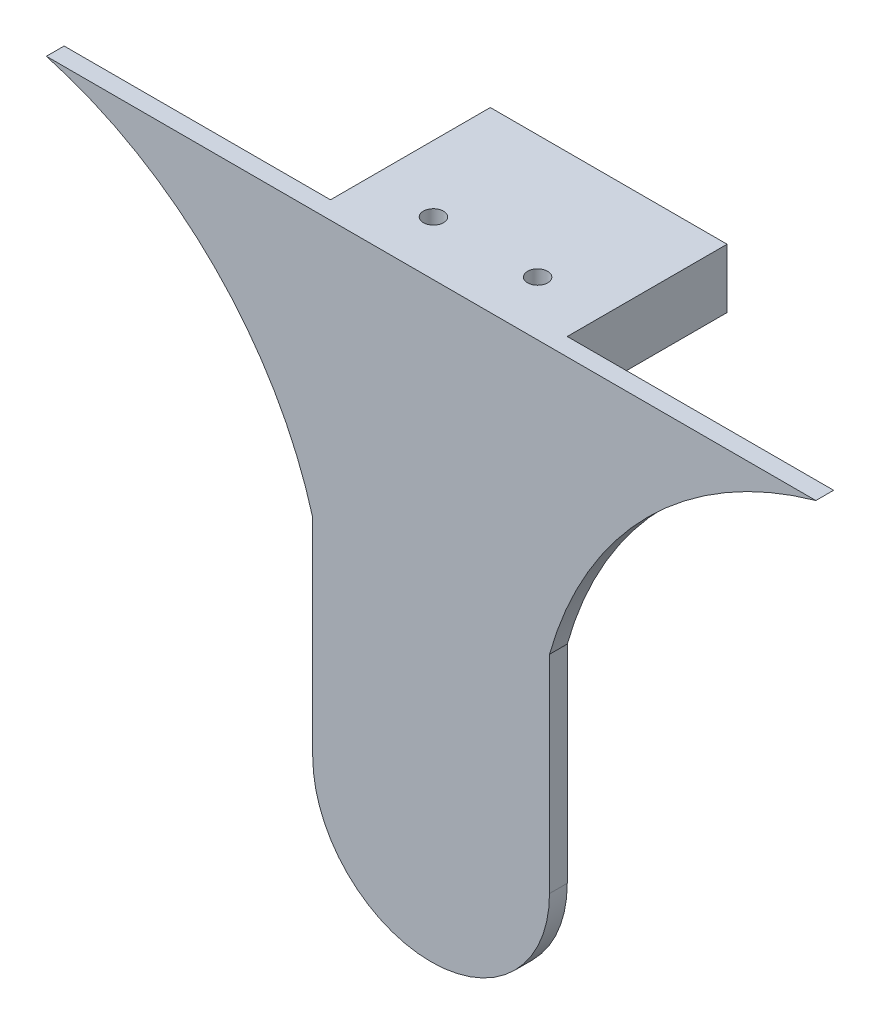
ISO-10303-21;
HEADER;
FILE_DESCRIPTION(('STEP AP214'),'2;1');
FILE_NAME('part.step','',(''),(''),'','','');
FILE_SCHEMA(('AUTOMOTIVE_DESIGN { 1 0 10303 214 1 1 1 1 }'));
ENDSEC;
DATA;
#1=APPLICATION_CONTEXT('core data for automotive mechanical design processes');
#2=APPLICATION_PROTOCOL_DEFINITION('international standard','automotive_design',2000,#1);
#3=PRODUCT_CONTEXT('',#1,'mechanical');
#4=PRODUCT('Part','Part','',(#3));
#5=PRODUCT_RELATED_PRODUCT_CATEGORY('part','',(#4));
#6=PRODUCT_DEFINITION_FORMATION('','',#4);
#7=PRODUCT_DEFINITION_CONTEXT('part definition',#1,'design');
#8=PRODUCT_DEFINITION('design','',#6,#7);
#9=PRODUCT_DEFINITION_SHAPE('','',#8);
#10=(LENGTH_UNIT() NAMED_UNIT(*) SI_UNIT(.MILLI.,.METRE.));
#11=(NAMED_UNIT(*) PLANE_ANGLE_UNIT() SI_UNIT($,.RADIAN.));
#12=(NAMED_UNIT(*) SI_UNIT($,.STERADIAN.) SOLID_ANGLE_UNIT());
#13=UNCERTAINTY_MEASURE_WITH_UNIT(LENGTH_MEASURE(1.E-05),#10,'distance_accuracy_value','');
#14=(GEOMETRIC_REPRESENTATION_CONTEXT(3) GLOBAL_UNCERTAINTY_ASSIGNED_CONTEXT((#13)) GLOBAL_UNIT_ASSIGNED_CONTEXT((#10,
#11,#12)) REPRESENTATION_CONTEXT('',''));
#15=CARTESIAN_POINT('',(0.,0.,0.));
#16=DIRECTION('',(0.,0.,1.));
#17=DIRECTION('',(1.,0.,0.));
#18=AXIS2_PLACEMENT_3D('',#15,#16,#17);
#19=CARTESIAN_POINT('',(0.,74.4444444444444,3.));
#20=DIRECTION('',(1.,0.,0.));
#21=DIRECTION('',(0.,1.,0.));
#22=AXIS2_PLACEMENT_3D('',#19,#20,#21);
#23=PLANE('',#22);
#24=DIRECTION('',(0.,-1.,0.));
#25=VECTOR('',#24,1.);
#26=CARTESIAN_POINT('',(0.,0.,0.));
#27=LINE('',#26,#25);
#28=CARTESIAN_POINT('',(0.,74.4444444444444,0.));
#29=VERTEX_POINT('',#28);
#30=CARTESIAN_POINT('',(0.,64.4444444444444,0.));
#31=VERTEX_POINT('',#30);
#32=EDGE_CURVE('E128',#29,#31,#27,.T.);
#33=ORIENTED_EDGE('',*,*,#32,.F.);
#34=DIRECTION('',(0.,0.,-1.));
#35=VECTOR('',#34,1.);
#36=CARTESIAN_POINT('',(0.,74.4444444444444,3.));
#37=LINE('',#36,#35);
#38=CARTESIAN_POINT('',(0.,74.4444444444444,-27.));
#39=VERTEX_POINT('',#38);
#40=EDGE_CURVE('E142',#29,#39,#37,.T.);
#41=ORIENTED_EDGE('',*,*,#40,.T.);
#42=DIRECTION('',(0.,1.,0.));
#43=VECTOR('',#42,1.);
#44=CARTESIAN_POINT('',(0.,74.4444444444444,-27.));
#45=LINE('',#44,#43);
#46=CARTESIAN_POINT('',(0.,64.4444444444444,-27.));
#47=VERTEX_POINT('',#46);
#48=EDGE_CURVE('E180',#47,#39,#45,.T.);
#49=ORIENTED_EDGE('',*,*,#48,.F.);
#50=DIRECTION('',(0.,0.,1.));
#51=VECTOR('',#50,1.);
#52=CARTESIAN_POINT('',(0.,64.4444444444444,-27.));
#53=LINE('',#52,#51);
#54=EDGE_CURVE('E186',#47,#31,#53,.T.);
#55=ORIENTED_EDGE('',*,*,#54,.T.);
#56=EDGE_LOOP('',(#33,#41,#49,#55));
#57=FACE_BOUND('',#56,.T.);
#58=ADVANCED_FACE('F38',(#57),#23,.F.);
#59=CARTESIAN_POINT('',(40.,74.4444444444444,3.));
#60=DIRECTION('',(-1.,0.,0.));
#61=DIRECTION('',(0.,-1.,0.));
#62=AXIS2_PLACEMENT_3D('',#59,#60,#61);
#63=PLANE('',#62);
#64=DIRECTION('',(0.,0.,1.));
#65=VECTOR('',#64,1.);
#66=CARTESIAN_POINT('',(40.,29.4444444444443,0.));
#67=LINE('',#66,#65);
#68=CARTESIAN_POINT('',(40.,29.4444444444443,0.));
#69=VERTEX_POINT('',#68);
#70=CARTESIAN_POINT('',(40.,29.4444444444443,3.));
#71=VERTEX_POINT('',#70);
#72=EDGE_CURVE('E157',#69,#71,#67,.T.);
#73=ORIENTED_EDGE('',*,*,#72,.T.);
#74=DIRECTION('',(0.,1.,0.));
#75=VECTOR('',#74,1.);
#76=CARTESIAN_POINT('',(40.,74.4444444444444,3.));
#77=LINE('',#76,#75);
#78=CARTESIAN_POINT('',(40.,-5.55555555555565,3.));
#79=VERTEX_POINT('',#78);
#80=EDGE_CURVE('E196',#79,#71,#77,.T.);
#81=ORIENTED_EDGE('',*,*,#80,.F.);
#82=DIRECTION('',(0.,0.,-1.));
#83=VECTOR('',#82,1.);
#84=CARTESIAN_POINT('',(40.,-5.55555555555565,3.));
#85=LINE('',#84,#83);
#86=CARTESIAN_POINT('',(40.,-5.55555555555565,0.));
#87=VERTEX_POINT('',#86);
#88=EDGE_CURVE('E208',#79,#87,#85,.T.);
#89=ORIENTED_EDGE('',*,*,#88,.T.);
#90=DIRECTION('',(0.,1.,0.));
#91=VECTOR('',#90,1.);
#92=CARTESIAN_POINT('',(40.,74.4444444444444,0.));
#93=LINE('',#92,#91);
#94=EDGE_CURVE('E197',#87,#69,#93,.T.);
#95=ORIENTED_EDGE('',*,*,#94,.T.);
#96=EDGE_LOOP('',(#73,#81,#89,#95));
#97=FACE_BOUND('',#96,.T.);
#98=ADVANCED_FACE('F224',(#97),#63,.F.);
#99=DIRECTION('',(0.,1.,0.));
#100=VECTOR('',#99,1.);
#101=CARTESIAN_POINT('',(40.,0.,0.));
#102=LINE('',#101,#100);
#103=CARTESIAN_POINT('',(40.,64.4444444444444,0.));
#104=VERTEX_POINT('',#103);
#105=CARTESIAN_POINT('',(40.,74.4444444444444,0.));
#106=VERTEX_POINT('',#105);
#107=EDGE_CURVE('E153',#104,#106,#102,.T.);
#108=ORIENTED_EDGE('',*,*,#107,.F.);
#109=DIRECTION('',(0.,0.,1.));
#110=VECTOR('',#109,1.);
#111=CARTESIAN_POINT('',(40.,64.4444444444444,-27.));
#112=LINE('',#111,#110);
#113=CARTESIAN_POINT('',(40.,64.4444444444444,-27.));
#114=VERTEX_POINT('',#113);
#115=EDGE_CURVE('E191',#114,#104,#112,.T.);
#116=ORIENTED_EDGE('',*,*,#115,.F.);
#117=DIRECTION('',(0.,-1.,0.));
#118=VECTOR('',#117,1.);
#119=CARTESIAN_POINT('',(40.,74.4444444444444,-27.));
#120=LINE('',#119,#118);
#121=CARTESIAN_POINT('',(40.,74.4444444444444,-27.));
#122=VERTEX_POINT('',#121);
#123=EDGE_CURVE('E175',#122,#114,#120,.T.);
#124=ORIENTED_EDGE('',*,*,#123,.F.);
#125=DIRECTION('',(0.,0.,-1.));
#126=VECTOR('',#125,1.);
#127=CARTESIAN_POINT('',(40.,74.4444444444444,3.));
#128=LINE('',#127,#126);
#129=EDGE_CURVE('E206',#106,#122,#128,.T.);
#130=ORIENTED_EDGE('',*,*,#129,.F.);
#131=EDGE_LOOP('',(#108,#116,#124,#130));
#132=FACE_BOUND('',#131,.T.);
#133=ADVANCED_FACE('F242',(#132),#63,.F.);
#134=CARTESIAN_POINT('',(0.,0.,0.));
#135=DIRECTION('',(0.,0.,1.));
#136=DIRECTION('',(1.,0.,0.));
#137=AXIS2_PLACEMENT_3D('',#134,#135,#136);
#138=PLANE('',#137);
#139=DIRECTION('',(-1.,0.,0.));
#140=VECTOR('',#139,1.);
#141=CARTESIAN_POINT('',(40.,64.4444444444444,0.));
#142=LINE('',#141,#140);
#143=EDGE_CURVE('E174',#104,#31,#142,.T.);
#144=ORIENTED_EDGE('',*,*,#143,.F.);
#145=ORIENTED_EDGE('',*,*,#107,.T.);
#146=DIRECTION('',(1.,0.,0.));
#147=VECTOR('',#146,1.);
#148=CARTESIAN_POINT('',(0.,74.4444444444444,0.));
#149=LINE('',#148,#147);
#150=CARTESIAN_POINT('',(85.,74.4444444444444,0.));
#151=VERTEX_POINT('',#150);
#152=EDGE_CURVE('E151',#106,#151,#149,.T.);
#153=ORIENTED_EDGE('',*,*,#152,.T.);
#154=CARTESIAN_POINT('',(102.5,11.9444444444443,0.));
#155=DIRECTION('',(0.,0.,1.));
#156=DIRECTION('',(1.,0.,0.));
#157=AXIS2_PLACEMENT_3D('',#154,#155,#156);
#158=CIRCLE('',#157,64.9037749287359);
#159=EDGE_CURVE('E149',#151,#69,#158,.T.);
#160=ORIENTED_EDGE('',*,*,#159,.T.);
#161=ORIENTED_EDGE('',*,*,#94,.F.);
#162=CARTESIAN_POINT('',(20.,-5.55555555555565,0.));
#163=DIRECTION('',(0.,0.,1.));
#164=DIRECTION('',(1.,0.,0.));
#165=AXIS2_PLACEMENT_3D('',#162,#163,#164);
#166=CIRCLE('',#165,20.);
#167=CARTESIAN_POINT('',(20.,-25.5555555555556,0.));
#168=VERTEX_POINT('',#167);
#169=EDGE_CURVE('E213',#87,#168,#166,.F.);
#170=ORIENTED_EDGE('',*,*,#169,.T.);
#171=CARTESIAN_POINT('',(20.,-5.55555555555565,0.));
#172=DIRECTION('',(0.,0.,1.));
#173=DIRECTION('',(1.,0.,0.));
#174=AXIS2_PLACEMENT_3D('',#171,#172,#173);
#175=CIRCLE('',#174,20.);
#176=CARTESIAN_POINT('',(0.,-5.55555555555565,0.));
#177=VERTEX_POINT('',#176);
#178=EDGE_CURVE('E211',#168,#177,#175,.F.);
#179=ORIENTED_EDGE('',*,*,#178,.T.);
#180=DIRECTION('',(0.,-1.,0.));
#181=VECTOR('',#180,1.);
#182=CARTESIAN_POINT('',(0.,74.4444444444444,0.));
#183=LINE('',#182,#181);
#184=CARTESIAN_POINT('',(0.,29.4444444444447,0.));
#185=VERTEX_POINT('',#184);
#186=EDGE_CURVE('E137',#185,#177,#183,.T.);
#187=ORIENTED_EDGE('',*,*,#186,.F.);
#188=CARTESIAN_POINT('',(-62.4999999999998,11.944444444444,0.));
#189=DIRECTION('',(0.,0.,1.));
#190=DIRECTION('',(1.,0.,0.));
#191=AXIS2_PLACEMENT_3D('',#188,#189,#190);
#192=CIRCLE('',#191,64.9037749287358);
#193=CARTESIAN_POINT('',(-45.,74.4444444444443,0.));
#194=VERTEX_POINT('',#193);
#195=EDGE_CURVE('E123',#194,#185,#192,.F.);
#196=ORIENTED_EDGE('',*,*,#195,.F.);
#197=DIRECTION('',(-1.,0.,0.));
#198=VECTOR('',#197,1.);
#199=CARTESIAN_POINT('',(0.,74.4444444444444,0.));
#200=LINE('',#199,#198);
#201=EDGE_CURVE('E134',#29,#194,#200,.T.);
#202=ORIENTED_EDGE('',*,*,#201,.F.);
#203=ORIENTED_EDGE('',*,*,#32,.T.);
#204=EDGE_LOOP('',(#144,#145,#153,#160,#161,#170,#179,#187,#196,#202,#203));
#205=FACE_BOUND('',#204,.T.);
#206=ADVANCED_FACE('F133',(#205),#138,.F.);
#207=DIRECTION('',(0.,-1.,0.));
#208=VECTOR('',#207,1.);
#209=CARTESIAN_POINT('',(0.,74.4444444444444,3.));
#210=LINE('',#209,#208);
#211=CARTESIAN_POINT('',(0.,29.4444444444447,3.));
#212=VERTEX_POINT('',#211);
#213=CARTESIAN_POINT('',(0.,-5.55555555555565,3.));
#214=VERTEX_POINT('',#213);
#215=EDGE_CURVE('E194',#212,#214,#210,.T.);
#216=ORIENTED_EDGE('',*,*,#215,.F.);
#217=DIRECTION('',(0.,0.,1.));
#218=VECTOR('',#217,1.);
#219=CARTESIAN_POINT('',(0.,29.4444444444447,0.));
#220=LINE('',#219,#218);
#221=EDGE_CURVE('E127',#185,#212,#220,.T.);
#222=ORIENTED_EDGE('',*,*,#221,.F.);
#223=ORIENTED_EDGE('',*,*,#186,.T.);
#224=DIRECTION('',(0.,0.,-1.));
#225=VECTOR('',#224,1.);
#226=CARTESIAN_POINT('',(0.,-5.55555555555565,3.));
#227=LINE('',#226,#225);
#228=EDGE_CURVE('E11',#177,#214,#227,.F.);
#229=ORIENTED_EDGE('',*,*,#228,.T.);
#230=EDGE_LOOP('',(#216,#222,#223,#229));
#231=FACE_BOUND('',#230,.T.);
#232=ADVANCED_FACE('F233',(#231),#23,.F.);
#233=CARTESIAN_POINT('',(0.,74.4444444444444,3.));
#234=DIRECTION('',(0.,-1.,0.));
#235=DIRECTION('',(0.,0.,-1.));
#236=AXIS2_PLACEMENT_3D('',#233,#234,#235);
#237=PLANE('',#236);
#238=CARTESIAN_POINT('',(28.8,74.4444444444444,-6.19088348796296));
#239=DIRECTION('',(0.,-1.,0.));
#240=DIRECTION('',(0.,0.,-1.));
#241=AXIS2_PLACEMENT_3D('',#238,#239,#240);
#242=CIRCLE('',#241,1.7);
#243=CARTESIAN_POINT('',(28.8,74.4444444444444,-7.89088348796296));
#244=VERTEX_POINT('',#243);
#245=EDGE_CURVE('E165',#244,#244,#242,.T.);
#246=ORIENTED_EDGE('',*,*,#245,.T.);
#247=EDGE_LOOP('',(#246));
#248=FACE_BOUND('',#247,.T.);
#249=CARTESIAN_POINT('',(11.2,74.4444444444444,-6.19088348796296));
#250=DIRECTION('',(0.,-1.,0.));
#251=DIRECTION('',(0.,0.,-1.));
#252=AXIS2_PLACEMENT_3D('',#249,#250,#251);
#253=CIRCLE('',#252,1.7);
#254=CARTESIAN_POINT('',(11.2,74.4444444444444,-7.89088348796296));
#255=VERTEX_POINT('',#254);
#256=EDGE_CURVE('E171',#255,#255,#253,.T.);
#257=ORIENTED_EDGE('',*,*,#256,.T.);
#258=EDGE_LOOP('',(#257));
#259=FACE_BOUND('',#258,.T.);
#260=DIRECTION('',(-1.,0.,0.));
#261=VECTOR('',#260,1.);
#262=CARTESIAN_POINT('',(0.,74.4444444444444,3.));
#263=LINE('',#262,#261);
#264=CARTESIAN_POINT('',(85.,74.4444444444444,3.));
#265=VERTEX_POINT('',#264);
#266=CARTESIAN_POINT('',(-45.,74.4444444444443,3.));
#267=VERTEX_POINT('',#266);
#268=EDGE_CURVE('E200',#265,#267,#263,.T.);
#269=ORIENTED_EDGE('',*,*,#268,.F.);
#270=DIRECTION('',(0.,0.,1.));
#271=VECTOR('',#270,1.);
#272=CARTESIAN_POINT('',(85.,74.4444444444444,0.));
#273=LINE('',#272,#271);
#274=EDGE_CURVE('E155',#151,#265,#273,.T.);
#275=ORIENTED_EDGE('',*,*,#274,.F.);
#276=ORIENTED_EDGE('',*,*,#152,.F.);
#277=ORIENTED_EDGE('',*,*,#129,.T.);
#278=DIRECTION('',(1.,0.,0.));
#279=VECTOR('',#278,1.);
#280=CARTESIAN_POINT('',(40.,74.4444444444444,-27.));
#281=LINE('',#280,#279);
#282=EDGE_CURVE('E183',#39,#122,#281,.T.);
#283=ORIENTED_EDGE('',*,*,#282,.F.);
#284=ORIENTED_EDGE('',*,*,#40,.F.);
#285=ORIENTED_EDGE('',*,*,#201,.T.);
#286=DIRECTION('',(0.,0.,1.));
#287=VECTOR('',#286,1.);
#288=CARTESIAN_POINT('',(-45.,74.4444444444443,0.));
#289=LINE('',#288,#287);
#290=EDGE_CURVE('E120',#194,#267,#289,.T.);
#291=ORIENTED_EDGE('',*,*,#290,.T.);
#292=EDGE_LOOP('',(#269,#275,#276,#277,#283,#284,#285,#291));
#293=FACE_BOUND('',#292,.T.);
#294=ADVANCED_FACE('F140',(#248,#259,#293),#237,.F.);
#295=CARTESIAN_POINT('',(0.,0.,3.));
#296=DIRECTION('',(0.,0.,1.));
#297=DIRECTION('',(1.,0.,0.));
#298=AXIS2_PLACEMENT_3D('',#295,#296,#297);
#299=PLANE('',#298);
#300=CARTESIAN_POINT('',(20.,-5.55555555555565,3.));
#301=DIRECTION('',(0.,0.,1.));
#302=DIRECTION('',(1.,0.,0.));
#303=AXIS2_PLACEMENT_3D('',#300,#301,#302);
#304=CIRCLE('',#303,20.);
#305=CARTESIAN_POINT('',(20.,-25.5555555555556,3.));
#306=VERTEX_POINT('',#305);
#307=EDGE_CURVE('E60',#214,#306,#304,.T.);
#308=ORIENTED_EDGE('',*,*,#307,.T.);
#309=CARTESIAN_POINT('',(20.,-5.55555555555565,3.));
#310=DIRECTION('',(0.,0.,1.));
#311=DIRECTION('',(1.,0.,0.));
#312=AXIS2_PLACEMENT_3D('',#309,#310,#311);
#313=CIRCLE('',#312,20.);
#314=EDGE_CURVE('E47',#306,#79,#313,.T.);
#315=ORIENTED_EDGE('',*,*,#314,.T.);
#316=ORIENTED_EDGE('',*,*,#80,.T.);
#317=CARTESIAN_POINT('',(102.5,11.9444444444443,3.));
#318=DIRECTION('',(0.,0.,1.));
#319=DIRECTION('',(1.,0.,0.));
#320=AXIS2_PLACEMENT_3D('',#317,#318,#319);
#321=CIRCLE('',#320,64.9037749287359);
#322=EDGE_CURVE('E147',#265,#71,#321,.T.);
#323=ORIENTED_EDGE('',*,*,#322,.F.);
#324=ORIENTED_EDGE('',*,*,#268,.T.);
#325=CARTESIAN_POINT('',(-62.4999999999998,11.944444444444,3.));
#326=DIRECTION('',(0.,0.,1.));
#327=DIRECTION('',(1.,0.,0.));
#328=AXIS2_PLACEMENT_3D('',#325,#326,#327);
#329=CIRCLE('',#328,64.9037749287358);
#330=EDGE_CURVE('E54',#267,#212,#329,.F.);
#331=ORIENTED_EDGE('',*,*,#330,.T.);
#332=ORIENTED_EDGE('',*,*,#215,.T.);
#333=EDGE_LOOP('',(#308,#315,#316,#323,#324,#331,#332));
#334=FACE_BOUND('',#333,.T.);
#335=ADVANCED_FACE('F218',(#334),#299,.T.);
#336=CARTESIAN_POINT('',(20.,-5.55555555555565,3.));
#337=DIRECTION('',(0.,0.,-1.));
#338=DIRECTION('',(-1.,0.,0.));
#339=AXIS2_PLACEMENT_3D('',#336,#337,#338);
#340=CYLINDRICAL_SURFACE('',#339,20.);
#341=DIRECTION('',(0.,0.,-1.));
#342=VECTOR('',#341,1.);
#343=CARTESIAN_POINT('',(20.,-25.5555555555556,3.));
#344=LINE('',#343,#342);
#345=EDGE_CURVE('E42',#306,#168,#344,.T.);
#346=ORIENTED_EDGE('',*,*,#345,.F.);
#347=ORIENTED_EDGE('',*,*,#307,.F.);
#348=ORIENTED_EDGE('',*,*,#228,.F.);
#349=ORIENTED_EDGE('',*,*,#178,.F.);
#350=EDGE_LOOP('',(#346,#347,#348,#349));
#351=FACE_BOUND('',#350,.T.);
#352=ADVANCED_FACE('F40',(#351),#340,.T.);
#353=CARTESIAN_POINT('',(20.,-5.55555555555565,3.));
#354=DIRECTION('',(0.,0.,-1.));
#355=DIRECTION('',(-1.,0.,0.));
#356=AXIS2_PLACEMENT_3D('',#353,#354,#355);
#357=CYLINDRICAL_SURFACE('',#356,20.);
#358=ORIENTED_EDGE('',*,*,#314,.F.);
#359=ORIENTED_EDGE('',*,*,#345,.T.);
#360=ORIENTED_EDGE('',*,*,#169,.F.);
#361=ORIENTED_EDGE('',*,*,#88,.F.);
#362=EDGE_LOOP('',(#358,#359,#360,#361));
#363=FACE_BOUND('',#362,.T.);
#364=ADVANCED_FACE('F227',(#363),#357,.T.);
#365=CARTESIAN_POINT('',(40.,64.4444444444444,-27.));
#366=DIRECTION('',(0.,1.,0.));
#367=DIRECTION('',(0.,0.,1.));
#368=AXIS2_PLACEMENT_3D('',#365,#366,#367);
#369=PLANE('',#368);
#370=CARTESIAN_POINT('',(28.8,64.4444444444444,-6.19088348796296));
#371=DIRECTION('',(0.,-1.,0.));
#372=DIRECTION('',(0.,0.,-1.));
#373=AXIS2_PLACEMENT_3D('',#370,#371,#372);
#374=CIRCLE('',#373,1.69999999999999);
#375=CARTESIAN_POINT('',(28.8,64.4444444444444,-7.89088348796295));
#376=VERTEX_POINT('',#375);
#377=EDGE_CURVE('E160',#376,#376,#374,.T.);
#378=ORIENTED_EDGE('',*,*,#377,.F.);
#379=EDGE_LOOP('',(#378));
#380=FACE_BOUND('',#379,.T.);
#381=CARTESIAN_POINT('',(11.2,64.4444444444444,-6.19088348796296));
#382=DIRECTION('',(0.,-1.,0.));
#383=DIRECTION('',(0.,0.,-1.));
#384=AXIS2_PLACEMENT_3D('',#381,#382,#383);
#385=CIRCLE('',#384,1.69999999999999);
#386=CARTESIAN_POINT('',(11.2,64.4444444444444,-7.89088348796295));
#387=VERTEX_POINT('',#386);
#388=EDGE_CURVE('E168',#387,#387,#385,.T.);
#389=ORIENTED_EDGE('',*,*,#388,.F.);
#390=EDGE_LOOP('',(#389));
#391=FACE_BOUND('',#390,.T.);
#392=ORIENTED_EDGE('',*,*,#143,.T.);
#393=ORIENTED_EDGE('',*,*,#54,.F.);
#394=DIRECTION('',(-1.,0.,0.));
#395=VECTOR('',#394,1.);
#396=CARTESIAN_POINT('',(40.,64.4444444444444,-27.));
#397=LINE('',#396,#395);
#398=EDGE_CURVE('E178',#114,#47,#397,.T.);
#399=ORIENTED_EDGE('',*,*,#398,.F.);
#400=ORIENTED_EDGE('',*,*,#115,.T.);
#401=EDGE_LOOP('',(#392,#393,#399,#400));
#402=FACE_BOUND('',#401,.T.);
#403=ADVANCED_FACE('F253',(#380,#391,#402),#369,.F.);
#404=CARTESIAN_POINT('',(0.,0.,-27.));
#405=DIRECTION('',(0.,0.,-1.));
#406=DIRECTION('',(-1.,0.,0.));
#407=AXIS2_PLACEMENT_3D('',#404,#405,#406);
#408=PLANE('',#407);
#409=ORIENTED_EDGE('',*,*,#123,.T.);
#410=ORIENTED_EDGE('',*,*,#398,.T.);
#411=ORIENTED_EDGE('',*,*,#48,.T.);
#412=ORIENTED_EDGE('',*,*,#282,.T.);
#413=EDGE_LOOP('',(#409,#410,#411,#412));
#414=FACE_BOUND('',#413,.T.);
#415=ADVANCED_FACE('F277',(#414),#408,.T.);
#416=CARTESIAN_POINT('',(11.2,64.4444444444444,-6.19088348796296));
#417=DIRECTION('',(0.,-1.,0.));
#418=DIRECTION('',(0.,0.,-1.));
#419=AXIS2_PLACEMENT_3D('',#416,#417,#418);
#420=CYLINDRICAL_SURFACE('',#419,1.69999999999999);
#421=ORIENTED_EDGE('',*,*,#256,.F.);
#422=EDGE_LOOP('',(#421));
#423=FACE_BOUND('',#422,.T.);
#424=ORIENTED_EDGE('',*,*,#388,.T.);
#425=EDGE_LOOP('',(#424));
#426=FACE_BOUND('',#425,.T.);
#427=ADVANCED_FACE('F271',(#423,#426),#420,.F.);
#428=CARTESIAN_POINT('',(28.8,64.4444444444444,-6.19088348796296));
#429=DIRECTION('',(0.,-1.,0.));
#430=DIRECTION('',(0.,0.,-1.));
#431=AXIS2_PLACEMENT_3D('',#428,#429,#430);
#432=CYLINDRICAL_SURFACE('',#431,1.69999999999999);
#433=ORIENTED_EDGE('',*,*,#245,.F.);
#434=EDGE_LOOP('',(#433));
#435=FACE_BOUND('',#434,.T.);
#436=ORIENTED_EDGE('',*,*,#377,.T.);
#437=EDGE_LOOP('',(#436));
#438=FACE_BOUND('',#437,.T.);
#439=ADVANCED_FACE('F264',(#435,#438),#432,.F.);
#440=CARTESIAN_POINT('',(102.5,11.9444444444443,0.));
#441=DIRECTION('',(0.,0.,1.));
#442=DIRECTION('',(1.,0.,0.));
#443=AXIS2_PLACEMENT_3D('',#440,#441,#442);
#444=CYLINDRICAL_SURFACE('',#443,64.9037749287359);
#445=ORIENTED_EDGE('',*,*,#322,.T.);
#446=ORIENTED_EDGE('',*,*,#72,.F.);
#447=ORIENTED_EDGE('',*,*,#159,.F.);
#448=ORIENTED_EDGE('',*,*,#274,.T.);
#449=EDGE_LOOP('',(#445,#446,#447,#448));
#450=FACE_BOUND('',#449,.T.);
#451=ADVANCED_FACE('F262',(#450),#444,.F.);
#452=CARTESIAN_POINT('',(-62.4999999999998,11.944444444444,0.));
#453=DIRECTION('',(0.,0.,1.));
#454=DIRECTION('',(1.,0.,0.));
#455=AXIS2_PLACEMENT_3D('',#452,#453,#454);
#456=CYLINDRICAL_SURFACE('',#455,64.9037749287358);
#457=ORIENTED_EDGE('',*,*,#330,.F.);
#458=ORIENTED_EDGE('',*,*,#290,.F.);
#459=ORIENTED_EDGE('',*,*,#195,.T.);
#460=ORIENTED_EDGE('',*,*,#221,.T.);
#461=EDGE_LOOP('',(#457,#458,#459,#460));
#462=FACE_BOUND('',#461,.T.);
#463=ADVANCED_FACE('F122',(#462),#456,.F.);
#464=CLOSED_SHELL('',(#58,#98,#133,#206,#232,#294,#335,#352,#364,#403,#415,#427,#439,#451,#463));
#465=MANIFOLD_SOLID_BREP('B2',#464);
#466=ADVANCED_BREP_SHAPE_REPRESENTATION('',(#18,#465),#14);
#467=SHAPE_DEFINITION_REPRESENTATION(#9,#466);
ENDSEC;
END-ISO-10303-21;
